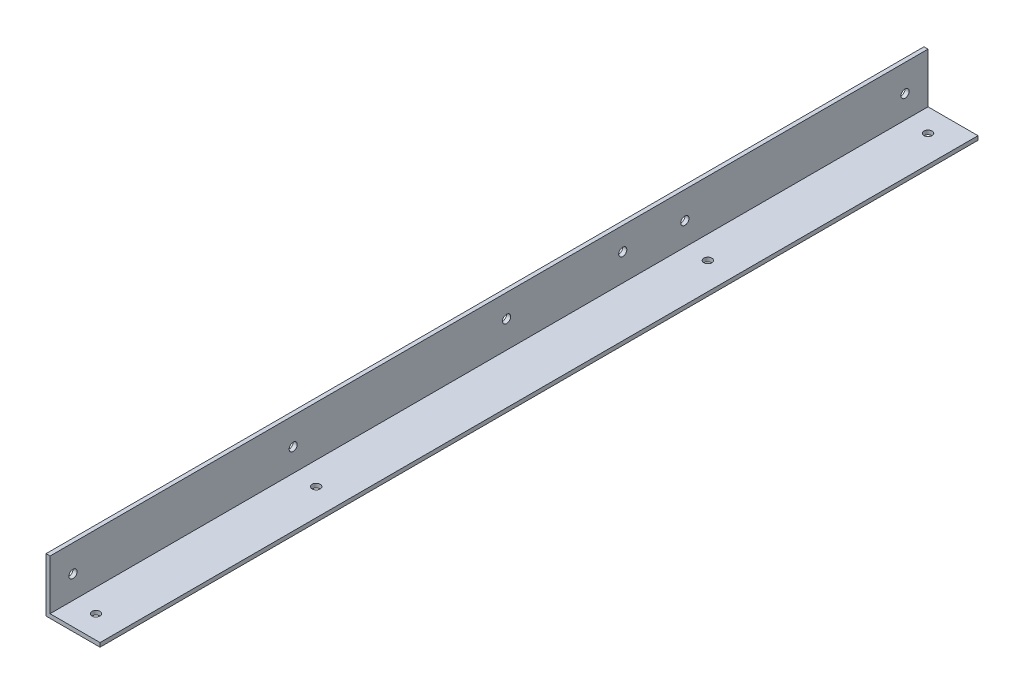
ISO-10303-21;
HEADER;
FILE_DESCRIPTION(('STEP AP214'),'2;1');
FILE_NAME('part.step','',(''),(''),'','','');
FILE_SCHEMA(('AUTOMOTIVE_DESIGN { 1 0 10303 214 1 1 1 1 }'));
ENDSEC;
DATA;
#1=APPLICATION_CONTEXT('core data for automotive mechanical design processes');
#2=APPLICATION_PROTOCOL_DEFINITION('international standard','automotive_design',2000,#1);
#3=PRODUCT_CONTEXT('',#1,'mechanical');
#4=PRODUCT('Part','Part','',(#3));
#5=PRODUCT_RELATED_PRODUCT_CATEGORY('part','',(#4));
#6=PRODUCT_DEFINITION_FORMATION('','',#4);
#7=PRODUCT_DEFINITION_CONTEXT('part definition',#1,'design');
#8=PRODUCT_DEFINITION('design','',#6,#7);
#9=PRODUCT_DEFINITION_SHAPE('','',#8);
#10=(LENGTH_UNIT() NAMED_UNIT(*) SI_UNIT(.MILLI.,.METRE.));
#11=(NAMED_UNIT(*) PLANE_ANGLE_UNIT() SI_UNIT($,.RADIAN.));
#12=(NAMED_UNIT(*) SI_UNIT($,.STERADIAN.) SOLID_ANGLE_UNIT());
#13=UNCERTAINTY_MEASURE_WITH_UNIT(LENGTH_MEASURE(1.E-05),#10,'distance_accuracy_value','');
#14=(GEOMETRIC_REPRESENTATION_CONTEXT(3) GLOBAL_UNCERTAINTY_ASSIGNED_CONTEXT((#13)) GLOBAL_UNIT_ASSIGNED_CONTEXT((#10,
#11,#12)) REPRESENTATION_CONTEXT('',''));
#15=CARTESIAN_POINT('',(0.,0.,0.));
#16=DIRECTION('',(0.,0.,1.));
#17=DIRECTION('',(1.,0.,0.));
#18=AXIS2_PLACEMENT_3D('',#15,#16,#17);
#19=CARTESIAN_POINT('',(-15.9316863798358,4.77336842105263,325.));
#20=DIRECTION('',(0.,-1.,0.));
#21=DIRECTION('',(1.,0.,0.));
#22=AXIS2_PLACEMENT_3D('',#19,#20,#21);
#23=PLANE('',#22);
#24=DIRECTION('',(-1.,0.,0.));
#25=VECTOR('',#24,1.);
#26=CARTESIAN_POINT('',(-15.9316863798358,4.77336842105263,0.));
#27=LINE('',#26,#25);
#28=CARTESIAN_POINT('',(-15.9316863798358,4.77336842105263,0.));
#29=VERTEX_POINT('',#28);
#30=CARTESIAN_POINT('',(-17.4316863798358,4.77336842105263,0.));
#31=VERTEX_POINT('',#30);
#32=EDGE_CURVE('E115',#29,#31,#27,.T.);
#33=ORIENTED_EDGE('',*,*,#32,.T.);
#34=DIRECTION('',(0.,0.,-1.));
#35=VECTOR('',#34,1.);
#36=CARTESIAN_POINT('',(-17.4316863798358,4.77336842105263,325.));
#37=LINE('',#36,#35);
#38=CARTESIAN_POINT('',(-17.4316863798358,4.77336842105263,325.));
#39=VERTEX_POINT('',#38);
#40=EDGE_CURVE('E11',#39,#31,#37,.T.);
#41=ORIENTED_EDGE('',*,*,#40,.F.);
#42=DIRECTION('',(-1.,0.,0.));
#43=VECTOR('',#42,1.);
#44=CARTESIAN_POINT('',(-15.9316863798358,4.77336842105263,325.));
#45=LINE('',#44,#43);
#46=CARTESIAN_POINT('',(-15.9316863798358,4.77336842105263,325.));
#47=VERTEX_POINT('',#46);
#48=EDGE_CURVE('E126',#47,#39,#45,.T.);
#49=ORIENTED_EDGE('',*,*,#48,.F.);
#50=DIRECTION('',(0.,0.,-1.));
#51=VECTOR('',#50,1.);
#52=CARTESIAN_POINT('',(-15.9316863798358,4.77336842105263,325.));
#53=LINE('',#52,#51);
#54=EDGE_CURVE('E111',#47,#29,#53,.T.);
#55=ORIENTED_EDGE('',*,*,#54,.T.);
#56=EDGE_LOOP('',(#33,#41,#49,#55));
#57=FACE_BOUND('',#56,.T.);
#58=ADVANCED_FACE('F31',(#57),#23,.F.);
#59=CARTESIAN_POINT('',(-17.4316863798358,4.77336842105263,325.));
#60=DIRECTION('',(1.,0.,0.));
#61=DIRECTION('',(0.,1.,0.));
#62=AXIS2_PLACEMENT_3D('',#59,#60,#61);
#63=PLANE('',#62);
#64=CARTESIAN_POINT('',(-17.4316863798358,-3.72663157894737,156.));
#65=DIRECTION('',(1.,0.,0.));
#66=DIRECTION('',(0.,1.,0.));
#67=AXIS2_PLACEMENT_3D('',#64,#65,#66);
#68=CIRCLE('',#67,1.5);
#69=CARTESIAN_POINT('',(-17.4316863798358,-2.22663157894737,156.));
#70=VERTEX_POINT('',#69);
#71=EDGE_CURVE('E308',#70,#70,#68,.T.);
#72=ORIENTED_EDGE('',*,*,#71,.T.);
#73=EDGE_LOOP('',(#72));
#74=FACE_BOUND('',#73,.T.);
#75=CARTESIAN_POINT('',(-17.4316863798358,-3.72663157894737,113.));
#76=DIRECTION('',(1.,0.,0.));
#77=DIRECTION('',(0.,1.,0.));
#78=AXIS2_PLACEMENT_3D('',#75,#76,#77);
#79=CIRCLE('',#78,1.5);
#80=CARTESIAN_POINT('',(-17.4316863798358,-2.22663157894737,113.));
#81=VERTEX_POINT('',#80);
#82=EDGE_CURVE('E312',#81,#81,#79,.T.);
#83=ORIENTED_EDGE('',*,*,#82,.T.);
#84=EDGE_LOOP('',(#83));
#85=FACE_BOUND('',#84,.T.);
#86=CARTESIAN_POINT('',(-17.4316863798358,-5.22663157894737,90.));
#87=DIRECTION('',(1.,0.,0.));
#88=DIRECTION('',(0.,1.,0.));
#89=AXIS2_PLACEMENT_3D('',#86,#87,#88);
#90=CIRCLE('',#89,1.5);
#91=CARTESIAN_POINT('',(-17.4316863798358,-3.72663157894737,90.));
#92=VERTEX_POINT('',#91);
#93=EDGE_CURVE('E321',#92,#92,#90,.T.);
#94=ORIENTED_EDGE('',*,*,#93,.T.);
#95=EDGE_LOOP('',(#94));
#96=FACE_BOUND('',#95,.T.);
#97=CARTESIAN_POINT('',(-17.4316863798358,-5.22663157894737,235.));
#98=DIRECTION('',(1.,0.,0.));
#99=DIRECTION('',(0.,1.,0.));
#100=AXIS2_PLACEMENT_3D('',#97,#98,#99);
#101=CIRCLE('',#100,1.50000000000003);
#102=CARTESIAN_POINT('',(-17.4316863798358,-3.72663157894734,235.));
#103=VERTEX_POINT('',#102);
#104=EDGE_CURVE('E327',#103,#103,#101,.T.);
#105=ORIENTED_EDGE('',*,*,#104,.T.);
#106=EDGE_LOOP('',(#105));
#107=FACE_BOUND('',#106,.T.);
#108=CARTESIAN_POINT('',(-17.4316863798358,-5.22663157894737,8.50000000000001));
#109=DIRECTION('',(1.,0.,0.));
#110=DIRECTION('',(0.,1.,0.));
#111=AXIS2_PLACEMENT_3D('',#108,#109,#110);
#112=CIRCLE('',#111,1.5);
#113=CARTESIAN_POINT('',(-17.4316863798358,-3.72663157894737,8.50000000000001));
#114=VERTEX_POINT('',#113);
#115=EDGE_CURVE('E333',#114,#114,#112,.T.);
#116=ORIENTED_EDGE('',*,*,#115,.T.);
#117=EDGE_LOOP('',(#116));
#118=FACE_BOUND('',#117,.T.);
#119=CARTESIAN_POINT('',(-17.4316863798358,-5.22663157894737,316.5));
#120=DIRECTION('',(1.,0.,0.));
#121=DIRECTION('',(0.,1.,0.));
#122=AXIS2_PLACEMENT_3D('',#119,#120,#121);
#123=CIRCLE('',#122,1.50000000000002);
#124=CARTESIAN_POINT('',(-17.4316863798358,-3.72663157894735,316.5));
#125=VERTEX_POINT('',#124);
#126=EDGE_CURVE('E339',#125,#125,#123,.T.);
#127=ORIENTED_EDGE('',*,*,#126,.T.);
#128=EDGE_LOOP('',(#127));
#129=FACE_BOUND('',#128,.T.);
#130=DIRECTION('',(0.,-1.,0.));
#131=VECTOR('',#130,1.);
#132=CARTESIAN_POINT('',(-17.4316863798358,4.77336842105263,0.));
#133=LINE('',#132,#131);
#134=CARTESIAN_POINT('',(-17.4316863798357,-15.2266315789474,0.));
#135=VERTEX_POINT('',#134);
#136=EDGE_CURVE('E118',#31,#135,#133,.T.);
#137=ORIENTED_EDGE('',*,*,#136,.T.);
#138=DIRECTION('',(0.,0.,-1.));
#139=VECTOR('',#138,1.);
#140=CARTESIAN_POINT('',(-17.4316863798357,-15.2266315789474,325.));
#141=LINE('',#140,#139);
#142=CARTESIAN_POINT('',(-17.4316863798357,-15.2266315789474,325.));
#143=VERTEX_POINT('',#142);
#144=EDGE_CURVE('E39',#143,#135,#141,.T.);
#145=ORIENTED_EDGE('',*,*,#144,.F.);
#146=DIRECTION('',(0.,-1.,0.));
#147=VECTOR('',#146,1.);
#148=CARTESIAN_POINT('',(-17.4316863798358,4.77336842105263,325.));
#149=LINE('',#148,#147);
#150=EDGE_CURVE('E84',#39,#143,#149,.T.);
#151=ORIENTED_EDGE('',*,*,#150,.F.);
#152=ORIENTED_EDGE('',*,*,#40,.T.);
#153=EDGE_LOOP('',(#137,#145,#151,#152));
#154=FACE_BOUND('',#153,.T.);
#155=ADVANCED_FACE('F154',(#74,#85,#96,#107,#118,#129,#154),#63,.F.);
#156=CARTESIAN_POINT('',(-17.4316863798357,-15.2266315789474,325.));
#157=DIRECTION('',(0.,1.,0.));
#158=DIRECTION('',(0.,0.,1.));
#159=AXIS2_PLACEMENT_3D('',#156,#157,#158);
#160=PLANE('',#159);
#161=CARTESIAN_POINT('',(-7.43168637983575,-15.2266315789474,90.));
#162=DIRECTION('',(0.,1.,0.));
#163=DIRECTION('',(0.,0.,1.));
#164=AXIS2_PLACEMENT_3D('',#161,#162,#163);
#165=CIRCLE('',#164,1.5);
#166=CARTESIAN_POINT('',(-7.43168637983575,-15.2266315789474,91.5));
#167=VERTEX_POINT('',#166);
#168=EDGE_CURVE('E345',#167,#167,#165,.T.);
#169=ORIENTED_EDGE('',*,*,#168,.T.);
#170=EDGE_LOOP('',(#169));
#171=FACE_BOUND('',#170,.T.);
#172=CARTESIAN_POINT('',(-7.43168637983575,-15.2266315789474,235.));
#173=DIRECTION('',(0.,1.,0.));
#174=DIRECTION('',(0.,0.,1.));
#175=AXIS2_PLACEMENT_3D('',#172,#173,#174);
#176=CIRCLE('',#175,1.5);
#177=CARTESIAN_POINT('',(-7.43168637983575,-15.2266315789474,236.5));
#178=VERTEX_POINT('',#177);
#179=EDGE_CURVE('E351',#178,#178,#176,.T.);
#180=ORIENTED_EDGE('',*,*,#179,.T.);
#181=EDGE_LOOP('',(#180));
#182=FACE_BOUND('',#181,.T.);
#183=CARTESIAN_POINT('',(-7.43168637983575,-15.2266315789474,316.5));
#184=DIRECTION('',(0.,1.,0.));
#185=DIRECTION('',(0.,0.,1.));
#186=AXIS2_PLACEMENT_3D('',#183,#184,#185);
#187=CIRCLE('',#186,1.5);
#188=CARTESIAN_POINT('',(-7.43168637983575,-15.2266315789474,318.));
#189=VERTEX_POINT('',#188);
#190=EDGE_CURVE('E357',#189,#189,#187,.T.);
#191=ORIENTED_EDGE('',*,*,#190,.T.);
#192=EDGE_LOOP('',(#191));
#193=FACE_BOUND('',#192,.T.);
#194=CARTESIAN_POINT('',(-7.43168637983575,-15.2266315789474,8.50000000000001));
#195=DIRECTION('',(0.,1.,0.));
#196=DIRECTION('',(0.,0.,1.));
#197=AXIS2_PLACEMENT_3D('',#194,#195,#196);
#198=CIRCLE('',#197,1.5);
#199=CARTESIAN_POINT('',(-7.43168637983575,-15.2266315789474,10.));
#200=VERTEX_POINT('',#199);
#201=EDGE_CURVE('E119',#200,#200,#198,.T.);
#202=ORIENTED_EDGE('',*,*,#201,.T.);
#203=EDGE_LOOP('',(#202));
#204=FACE_BOUND('',#203,.T.);
#205=DIRECTION('',(1.,0.,0.));
#206=VECTOR('',#205,1.);
#207=CARTESIAN_POINT('',(-17.4316863798357,-15.2266315789474,0.));
#208=LINE('',#207,#206);
#209=CARTESIAN_POINT('',(2.56831362016425,-15.2266315789474,0.));
#210=VERTEX_POINT('',#209);
#211=EDGE_CURVE('E121',#135,#210,#208,.T.);
#212=ORIENTED_EDGE('',*,*,#211,.T.);
#213=DIRECTION('',(0.,0.,-1.));
#214=VECTOR('',#213,1.);
#215=CARTESIAN_POINT('',(2.56831362016425,-15.2266315789474,325.));
#216=LINE('',#215,#214);
#217=CARTESIAN_POINT('',(2.56831362016425,-15.2266315789474,325.));
#218=VERTEX_POINT('',#217);
#219=EDGE_CURVE('E106',#218,#210,#216,.T.);
#220=ORIENTED_EDGE('',*,*,#219,.F.);
#221=DIRECTION('',(1.,0.,0.));
#222=VECTOR('',#221,1.);
#223=CARTESIAN_POINT('',(-17.4316863798357,-15.2266315789474,325.));
#224=LINE('',#223,#222);
#225=EDGE_CURVE('E97',#143,#218,#224,.T.);
#226=ORIENTED_EDGE('',*,*,#225,.F.);
#227=ORIENTED_EDGE('',*,*,#144,.T.);
#228=EDGE_LOOP('',(#212,#220,#226,#227));
#229=FACE_BOUND('',#228,.T.);
#230=ADVANCED_FACE('F132',(#171,#182,#193,#204,#229),#160,.F.);
#231=CARTESIAN_POINT('',(2.56831362016425,-15.2266315789474,325.));
#232=DIRECTION('',(-1.,0.,0.));
#233=DIRECTION('',(0.,0.,1.));
#234=AXIS2_PLACEMENT_3D('',#231,#232,#233);
#235=PLANE('',#234);
#236=DIRECTION('',(0.,1.,0.));
#237=VECTOR('',#236,1.);
#238=CARTESIAN_POINT('',(2.56831362016425,-15.2266315789474,0.));
#239=LINE('',#238,#237);
#240=CARTESIAN_POINT('',(2.56831362016425,-13.7266315789474,0.));
#241=VERTEX_POINT('',#240);
#242=EDGE_CURVE('E105',#210,#241,#239,.T.);
#243=ORIENTED_EDGE('',*,*,#242,.T.);
#244=DIRECTION('',(0.,0.,-1.));
#245=VECTOR('',#244,1.);
#246=CARTESIAN_POINT('',(2.56831362016425,-13.7266315789474,325.));
#247=LINE('',#246,#245);
#248=CARTESIAN_POINT('',(2.56831362016425,-13.7266315789474,325.));
#249=VERTEX_POINT('',#248);
#250=EDGE_CURVE('E102',#249,#241,#247,.T.);
#251=ORIENTED_EDGE('',*,*,#250,.F.);
#252=DIRECTION('',(0.,1.,0.));
#253=VECTOR('',#252,1.);
#254=CARTESIAN_POINT('',(2.56831362016425,-15.2266315789474,325.));
#255=LINE('',#254,#253);
#256=EDGE_CURVE('E91',#218,#249,#255,.T.);
#257=ORIENTED_EDGE('',*,*,#256,.F.);
#258=ORIENTED_EDGE('',*,*,#219,.T.);
#259=EDGE_LOOP('',(#243,#251,#257,#258));
#260=FACE_BOUND('',#259,.T.);
#261=ADVANCED_FACE('F103',(#260),#235,.F.);
#262=CARTESIAN_POINT('',(2.56831362016425,-13.7266315789474,325.));
#263=DIRECTION('',(0.,-1.,0.));
#264=DIRECTION('',(1.,0.,0.));
#265=AXIS2_PLACEMENT_3D('',#262,#263,#264);
#266=PLANE('',#265);
#267=CARTESIAN_POINT('',(-7.43168637983575,-13.7266315789474,90.));
#268=DIRECTION('',(0.,1.,0.));
#269=DIRECTION('',(-1.,0.,0.));
#270=AXIS2_PLACEMENT_3D('',#267,#268,#269);
#271=CIRCLE('',#270,1.5);
#272=CARTESIAN_POINT('',(-8.93168637983575,-13.7266315789474,90.));
#273=VERTEX_POINT('',#272);
#274=EDGE_CURVE('E342',#273,#273,#271,.T.);
#275=ORIENTED_EDGE('',*,*,#274,.F.);
#276=EDGE_LOOP('',(#275));
#277=FACE_BOUND('',#276,.T.);
#278=CARTESIAN_POINT('',(-7.43168637983575,-13.7266315789474,235.));
#279=DIRECTION('',(0.,1.,0.));
#280=DIRECTION('',(-1.,0.,0.));
#281=AXIS2_PLACEMENT_3D('',#278,#279,#280);
#282=CIRCLE('',#281,1.5);
#283=CARTESIAN_POINT('',(-8.93168637983575,-13.7266315789474,235.));
#284=VERTEX_POINT('',#283);
#285=EDGE_CURVE('E348',#284,#284,#282,.T.);
#286=ORIENTED_EDGE('',*,*,#285,.F.);
#287=EDGE_LOOP('',(#286));
#288=FACE_BOUND('',#287,.T.);
#289=CARTESIAN_POINT('',(-7.43168637983575,-13.7266315789474,316.5));
#290=DIRECTION('',(0.,1.,0.));
#291=DIRECTION('',(-1.,0.,0.));
#292=AXIS2_PLACEMENT_3D('',#289,#290,#291);
#293=CIRCLE('',#292,1.5);
#294=CARTESIAN_POINT('',(-8.93168637983575,-13.7266315789474,316.5));
#295=VERTEX_POINT('',#294);
#296=EDGE_CURVE('E354',#295,#295,#293,.T.);
#297=ORIENTED_EDGE('',*,*,#296,.F.);
#298=EDGE_LOOP('',(#297));
#299=FACE_BOUND('',#298,.T.);
#300=CARTESIAN_POINT('',(-7.43168637983575,-13.7266315789474,8.50000000000001));
#301=DIRECTION('',(0.,1.,0.));
#302=DIRECTION('',(-1.,0.,0.));
#303=AXIS2_PLACEMENT_3D('',#300,#301,#302);
#304=CIRCLE('',#303,1.5);
#305=CARTESIAN_POINT('',(-8.93168637983575,-13.7266315789474,8.50000000000001));
#306=VERTEX_POINT('',#305);
#307=EDGE_CURVE('E360',#306,#306,#304,.T.);
#308=ORIENTED_EDGE('',*,*,#307,.F.);
#309=EDGE_LOOP('',(#308));
#310=FACE_BOUND('',#309,.T.);
#311=DIRECTION('',(-1.,0.,0.));
#312=VECTOR('',#311,1.);
#313=CARTESIAN_POINT('',(2.56831362016425,-13.7266315789474,0.));
#314=LINE('',#313,#312);
#315=CARTESIAN_POINT('',(-15.9316863798358,-13.7266315789474,0.));
#316=VERTEX_POINT('',#315);
#317=EDGE_CURVE('E70',#241,#316,#314,.T.);
#318=ORIENTED_EDGE('',*,*,#317,.T.);
#319=DIRECTION('',(0.,0.,-1.));
#320=VECTOR('',#319,1.);
#321=CARTESIAN_POINT('',(-15.9316863798358,-13.7266315789474,325.));
#322=LINE('',#321,#320);
#323=CARTESIAN_POINT('',(-15.9316863798358,-13.7266315789474,325.));
#324=VERTEX_POINT('',#323);
#325=EDGE_CURVE('E107',#324,#316,#322,.T.);
#326=ORIENTED_EDGE('',*,*,#325,.F.);
#327=DIRECTION('',(-1.,0.,0.));
#328=VECTOR('',#327,1.);
#329=CARTESIAN_POINT('',(2.56831362016425,-13.7266315789474,325.));
#330=LINE('',#329,#328);
#331=EDGE_CURVE('E95',#249,#324,#330,.T.);
#332=ORIENTED_EDGE('',*,*,#331,.F.);
#333=ORIENTED_EDGE('',*,*,#250,.T.);
#334=EDGE_LOOP('',(#318,#326,#332,#333));
#335=FACE_BOUND('',#334,.T.);
#336=ADVANCED_FACE('F109',(#277,#288,#299,#310,#335),#266,.F.);
#337=CARTESIAN_POINT('',(-15.9316863798358,-13.7266315789474,325.));
#338=DIRECTION('',(-1.,0.,0.));
#339=DIRECTION('',(0.,0.,1.));
#340=AXIS2_PLACEMENT_3D('',#337,#338,#339);
#341=PLANE('',#340);
#342=CARTESIAN_POINT('',(-15.9316863798358,-3.72663157894737,156.));
#343=DIRECTION('',(1.,0.,0.));
#344=DIRECTION('',(0.,0.,-1.));
#345=AXIS2_PLACEMENT_3D('',#342,#343,#344);
#346=CIRCLE('',#345,1.5);
#347=CARTESIAN_POINT('',(-15.9316863798358,-3.72663157894737,154.5));
#348=VERTEX_POINT('',#347);
#349=EDGE_CURVE('E306',#348,#348,#346,.T.);
#350=ORIENTED_EDGE('',*,*,#349,.F.);
#351=EDGE_LOOP('',(#350));
#352=FACE_BOUND('',#351,.T.);
#353=CARTESIAN_POINT('',(-15.9316863798358,-3.72663157894737,113.));
#354=DIRECTION('',(1.,0.,0.));
#355=DIRECTION('',(0.,0.,-1.));
#356=AXIS2_PLACEMENT_3D('',#353,#354,#355);
#357=CIRCLE('',#356,1.5);
#358=CARTESIAN_POINT('',(-15.9316863798358,-3.72663157894737,111.5));
#359=VERTEX_POINT('',#358);
#360=EDGE_CURVE('E309',#359,#359,#357,.T.);
#361=ORIENTED_EDGE('',*,*,#360,.F.);
#362=EDGE_LOOP('',(#361));
#363=FACE_BOUND('',#362,.T.);
#364=CARTESIAN_POINT('',(-15.9316863798358,-5.22663157894737,90.));
#365=DIRECTION('',(1.,0.,0.));
#366=DIRECTION('',(0.,0.,-1.));
#367=AXIS2_PLACEMENT_3D('',#364,#365,#366);
#368=CIRCLE('',#367,1.5);
#369=CARTESIAN_POINT('',(-15.9316863798358,-5.22663157894737,88.5));
#370=VERTEX_POINT('',#369);
#371=EDGE_CURVE('E318',#370,#370,#368,.T.);
#372=ORIENTED_EDGE('',*,*,#371,.F.);
#373=EDGE_LOOP('',(#372));
#374=FACE_BOUND('',#373,.T.);
#375=CARTESIAN_POINT('',(-15.9316863798358,-5.22663157894737,235.));
#376=DIRECTION('',(1.,0.,0.));
#377=DIRECTION('',(0.,0.,-1.));
#378=AXIS2_PLACEMENT_3D('',#375,#376,#377);
#379=CIRCLE('',#378,1.50000000000003);
#380=CARTESIAN_POINT('',(-15.9316863798358,-5.22663157894737,233.5));
#381=VERTEX_POINT('',#380);
#382=EDGE_CURVE('E324',#381,#381,#379,.T.);
#383=ORIENTED_EDGE('',*,*,#382,.F.);
#384=EDGE_LOOP('',(#383));
#385=FACE_BOUND('',#384,.T.);
#386=CARTESIAN_POINT('',(-15.9316863798358,-5.22663157894737,8.50000000000001));
#387=DIRECTION('',(1.,0.,0.));
#388=DIRECTION('',(0.,0.,-1.));
#389=AXIS2_PLACEMENT_3D('',#386,#387,#388);
#390=CIRCLE('',#389,1.5);
#391=CARTESIAN_POINT('',(-15.9316863798358,-5.22663157894737,7.00000000000001));
#392=VERTEX_POINT('',#391);
#393=EDGE_CURVE('E330',#392,#392,#390,.T.);
#394=ORIENTED_EDGE('',*,*,#393,.F.);
#395=EDGE_LOOP('',(#394));
#396=FACE_BOUND('',#395,.T.);
#397=CARTESIAN_POINT('',(-15.9316863798358,-5.22663157894737,316.5));
#398=DIRECTION('',(1.,0.,0.));
#399=DIRECTION('',(0.,0.,-1.));
#400=AXIS2_PLACEMENT_3D('',#397,#398,#399);
#401=CIRCLE('',#400,1.50000000000002);
#402=CARTESIAN_POINT('',(-15.9316863798358,-5.22663157894737,315.));
#403=VERTEX_POINT('',#402);
#404=EDGE_CURVE('E336',#403,#403,#401,.T.);
#405=ORIENTED_EDGE('',*,*,#404,.F.);
#406=EDGE_LOOP('',(#405));
#407=FACE_BOUND('',#406,.T.);
#408=DIRECTION('',(0.,1.,0.));
#409=VECTOR('',#408,1.);
#410=CARTESIAN_POINT('',(-15.9316863798358,-13.7266315789474,0.));
#411=LINE('',#410,#409);
#412=EDGE_CURVE('E76',#316,#29,#411,.T.);
#413=ORIENTED_EDGE('',*,*,#412,.T.);
#414=ORIENTED_EDGE('',*,*,#54,.F.);
#415=DIRECTION('',(0.,1.,0.));
#416=VECTOR('',#415,1.);
#417=CARTESIAN_POINT('',(-15.9316863798358,-13.7266315789474,325.));
#418=LINE('',#417,#416);
#419=EDGE_CURVE('E47',#324,#47,#418,.T.);
#420=ORIENTED_EDGE('',*,*,#419,.F.);
#421=ORIENTED_EDGE('',*,*,#325,.T.);
#422=EDGE_LOOP('',(#413,#414,#420,#421));
#423=FACE_BOUND('',#422,.T.);
#424=ADVANCED_FACE('F139',(#352,#363,#374,#385,#396,#407,#423),#341,.F.);
#425=CARTESIAN_POINT('',(-17.4316863798358,4.77336842105263,325.));
#426=DIRECTION('',(0.,0.,1.));
#427=DIRECTION('',(1.,0.,0.));
#428=AXIS2_PLACEMENT_3D('',#425,#426,#427);
#429=PLANE('',#428);
#430=ORIENTED_EDGE('',*,*,#48,.T.);
#431=ORIENTED_EDGE('',*,*,#150,.T.);
#432=ORIENTED_EDGE('',*,*,#225,.T.);
#433=ORIENTED_EDGE('',*,*,#256,.T.);
#434=ORIENTED_EDGE('',*,*,#331,.T.);
#435=ORIENTED_EDGE('',*,*,#419,.T.);
#436=EDGE_LOOP('',(#430,#431,#432,#433,#434,#435));
#437=FACE_BOUND('',#436,.T.);
#438=ADVANCED_FACE('F93',(#437),#429,.T.);
#439=CARTESIAN_POINT('',(-17.4316863798358,4.77336842105263,0.));
#440=DIRECTION('',(0.,0.,1.));
#441=DIRECTION('',(1.,0.,0.));
#442=AXIS2_PLACEMENT_3D('',#439,#440,#441);
#443=PLANE('',#442);
#444=ORIENTED_EDGE('',*,*,#32,.F.);
#445=ORIENTED_EDGE('',*,*,#412,.F.);
#446=ORIENTED_EDGE('',*,*,#317,.F.);
#447=ORIENTED_EDGE('',*,*,#242,.F.);
#448=ORIENTED_EDGE('',*,*,#211,.F.);
#449=ORIENTED_EDGE('',*,*,#136,.F.);
#450=EDGE_LOOP('',(#444,#445,#446,#447,#448,#449));
#451=FACE_BOUND('',#450,.T.);
#452=ADVANCED_FACE('F135',(#451),#443,.F.);
#453=CARTESIAN_POINT('',(-7.43168637983563,-313.726631578947,8.50000000000001));
#454=DIRECTION('',(0.,1.,0.));
#455=DIRECTION('',(-1.,0.,0.));
#456=AXIS2_PLACEMENT_3D('',#453,#454,#455);
#457=CYLINDRICAL_SURFACE('',#456,1.5);
#458=ORIENTED_EDGE('',*,*,#307,.T.);
#459=EDGE_LOOP('',(#458));
#460=FACE_BOUND('',#459,.T.);
#461=ORIENTED_EDGE('',*,*,#201,.F.);
#462=EDGE_LOOP('',(#461));
#463=FACE_BOUND('',#462,.T.);
#464=ADVANCED_FACE('F186',(#460,#463),#457,.F.);
#465=CARTESIAN_POINT('',(-7.43168637983563,-313.726631578947,316.5));
#466=DIRECTION('',(0.,1.,0.));
#467=DIRECTION('',(-1.,0.,0.));
#468=AXIS2_PLACEMENT_3D('',#465,#466,#467);
#469=CYLINDRICAL_SURFACE('',#468,1.5);
#470=ORIENTED_EDGE('',*,*,#296,.T.);
#471=EDGE_LOOP('',(#470));
#472=FACE_BOUND('',#471,.T.);
#473=ORIENTED_EDGE('',*,*,#190,.F.);
#474=EDGE_LOOP('',(#473));
#475=FACE_BOUND('',#474,.T.);
#476=ADVANCED_FACE('F191',(#472,#475),#469,.F.);
#477=CARTESIAN_POINT('',(-7.43168637983563,-313.726631578947,235.));
#478=DIRECTION('',(0.,1.,0.));
#479=DIRECTION('',(-1.,0.,0.));
#480=AXIS2_PLACEMENT_3D('',#477,#478,#479);
#481=CYLINDRICAL_SURFACE('',#480,1.5);
#482=ORIENTED_EDGE('',*,*,#285,.T.);
#483=EDGE_LOOP('',(#482));
#484=FACE_BOUND('',#483,.T.);
#485=ORIENTED_EDGE('',*,*,#179,.F.);
#486=EDGE_LOOP('',(#485));
#487=FACE_BOUND('',#486,.T.);
#488=ADVANCED_FACE('F203',(#484,#487),#481,.F.);
#489=CARTESIAN_POINT('',(-7.43168637983563,-313.726631578947,90.));
#490=DIRECTION('',(0.,1.,0.));
#491=DIRECTION('',(-1.,0.,0.));
#492=AXIS2_PLACEMENT_3D('',#489,#490,#491);
#493=CYLINDRICAL_SURFACE('',#492,1.5);
#494=ORIENTED_EDGE('',*,*,#274,.T.);
#495=EDGE_LOOP('',(#494));
#496=FACE_BOUND('',#495,.T.);
#497=ORIENTED_EDGE('',*,*,#168,.F.);
#498=EDGE_LOOP('',(#497));
#499=FACE_BOUND('',#498,.T.);
#500=ADVANCED_FACE('F213',(#496,#499),#493,.F.);
#501=CARTESIAN_POINT('',(-315.931686379836,-5.22663157894737,316.5));
#502=DIRECTION('',(1.,0.,0.));
#503=DIRECTION('',(0.,0.,-1.));
#504=AXIS2_PLACEMENT_3D('',#501,#502,#503);
#505=CYLINDRICAL_SURFACE('',#504,1.50000000000002);
#506=ORIENTED_EDGE('',*,*,#404,.T.);
#507=EDGE_LOOP('',(#506));
#508=FACE_BOUND('',#507,.T.);
#509=ORIENTED_EDGE('',*,*,#126,.F.);
#510=EDGE_LOOP('',(#509));
#511=FACE_BOUND('',#510,.T.);
#512=ADVANCED_FACE('F222',(#508,#511),#505,.F.);
#513=CARTESIAN_POINT('',(-315.931686379836,-5.22663157894737,8.50000000000001));
#514=DIRECTION('',(1.,0.,0.));
#515=DIRECTION('',(0.,0.,-1.));
#516=AXIS2_PLACEMENT_3D('',#513,#514,#515);
#517=CYLINDRICAL_SURFACE('',#516,1.5);
#518=ORIENTED_EDGE('',*,*,#393,.T.);
#519=EDGE_LOOP('',(#518));
#520=FACE_BOUND('',#519,.T.);
#521=ORIENTED_EDGE('',*,*,#115,.F.);
#522=EDGE_LOOP('',(#521));
#523=FACE_BOUND('',#522,.T.);
#524=ADVANCED_FACE('F242',(#520,#523),#517,.F.);
#525=CARTESIAN_POINT('',(-315.931686379836,-5.22663157894737,235.));
#526=DIRECTION('',(1.,0.,0.));
#527=DIRECTION('',(0.,0.,-1.));
#528=AXIS2_PLACEMENT_3D('',#525,#526,#527);
#529=CYLINDRICAL_SURFACE('',#528,1.50000000000003);
#530=ORIENTED_EDGE('',*,*,#382,.T.);
#531=EDGE_LOOP('',(#530));
#532=FACE_BOUND('',#531,.T.);
#533=ORIENTED_EDGE('',*,*,#104,.F.);
#534=EDGE_LOOP('',(#533));
#535=FACE_BOUND('',#534,.T.);
#536=ADVANCED_FACE('F252',(#532,#535),#529,.F.);
#537=CARTESIAN_POINT('',(-315.931686379836,-5.22663157894737,90.));
#538=DIRECTION('',(1.,0.,0.));
#539=DIRECTION('',(0.,0.,-1.));
#540=AXIS2_PLACEMENT_3D('',#537,#538,#539);
#541=CYLINDRICAL_SURFACE('',#540,1.5);
#542=ORIENTED_EDGE('',*,*,#371,.T.);
#543=EDGE_LOOP('',(#542));
#544=FACE_BOUND('',#543,.T.);
#545=ORIENTED_EDGE('',*,*,#93,.F.);
#546=EDGE_LOOP('',(#545));
#547=FACE_BOUND('',#546,.T.);
#548=ADVANCED_FACE('F262',(#544,#547),#541,.F.);
#549=CARTESIAN_POINT('',(-315.931686379836,-3.72663157894737,113.));
#550=DIRECTION('',(1.,0.,0.));
#551=DIRECTION('',(0.,0.,-1.));
#552=AXIS2_PLACEMENT_3D('',#549,#550,#551);
#553=CYLINDRICAL_SURFACE('',#552,1.5);
#554=ORIENTED_EDGE('',*,*,#360,.T.);
#555=EDGE_LOOP('',(#554));
#556=FACE_BOUND('',#555,.T.);
#557=ORIENTED_EDGE('',*,*,#82,.F.);
#558=EDGE_LOOP('',(#557));
#559=FACE_BOUND('',#558,.T.);
#560=ADVANCED_FACE('F272',(#556,#559),#553,.F.);
#561=CARTESIAN_POINT('',(-315.931686379836,-3.72663157894737,156.));
#562=DIRECTION('',(1.,0.,0.));
#563=DIRECTION('',(0.,0.,-1.));
#564=AXIS2_PLACEMENT_3D('',#561,#562,#563);
#565=CYLINDRICAL_SURFACE('',#564,1.5);
#566=ORIENTED_EDGE('',*,*,#349,.T.);
#567=EDGE_LOOP('',(#566));
#568=FACE_BOUND('',#567,.T.);
#569=ORIENTED_EDGE('',*,*,#71,.F.);
#570=EDGE_LOOP('',(#569));
#571=FACE_BOUND('',#570,.T.);
#572=ADVANCED_FACE('F282',(#568,#571),#565,.F.);
#573=CLOSED_SHELL('',(#58,#155,#230,#261,#336,#424,#438,#452,#464,#476,#488,#500,#512,#524,#536,
#548,#560,#572));
#574=MANIFOLD_SOLID_BREP('B2',#573);
#575=ADVANCED_BREP_SHAPE_REPRESENTATION('',(#18,#574),#14);
#576=SHAPE_DEFINITION_REPRESENTATION(#9,#575);
ENDSEC;
END-ISO-10303-21;
